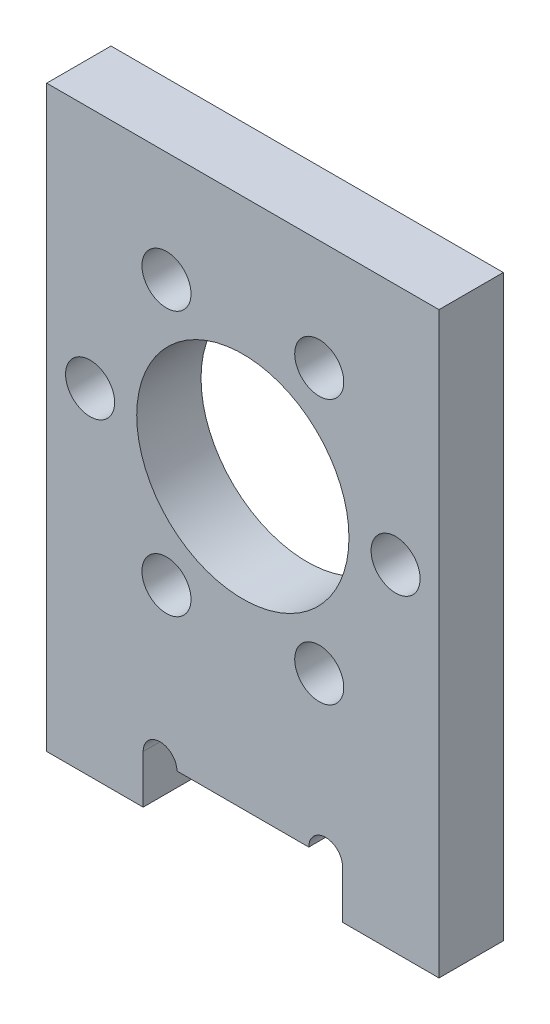
ISO-10303-21;
HEADER;
FILE_DESCRIPTION(('STEP AP214'),'2;1');
FILE_NAME('part.step','',(''),(''),'','','');
FILE_SCHEMA(('AUTOMOTIVE_DESIGN { 1 0 10303 214 1 1 1 1 }'));
ENDSEC;
DATA;
#1=APPLICATION_CONTEXT('core data for automotive mechanical design processes');
#2=APPLICATION_PROTOCOL_DEFINITION('international standard','automotive_design',2000,#1);
#3=PRODUCT_CONTEXT('',#1,'mechanical');
#4=PRODUCT('Part','Part','',(#3));
#5=PRODUCT_RELATED_PRODUCT_CATEGORY('part','',(#4));
#6=PRODUCT_DEFINITION_FORMATION('','',#4);
#7=PRODUCT_DEFINITION_CONTEXT('part definition',#1,'design');
#8=PRODUCT_DEFINITION('design','',#6,#7);
#9=PRODUCT_DEFINITION_SHAPE('','',#8);
#10=(LENGTH_UNIT() NAMED_UNIT(*) SI_UNIT(.MILLI.,.METRE.));
#11=(NAMED_UNIT(*) PLANE_ANGLE_UNIT() SI_UNIT($,.RADIAN.));
#12=(NAMED_UNIT(*) SI_UNIT($,.STERADIAN.) SOLID_ANGLE_UNIT());
#13=UNCERTAINTY_MEASURE_WITH_UNIT(LENGTH_MEASURE(1.E-05),#10,'distance_accuracy_value','');
#14=(GEOMETRIC_REPRESENTATION_CONTEXT(3) GLOBAL_UNCERTAINTY_ASSIGNED_CONTEXT((#13)) GLOBAL_UNIT_ASSIGNED_CONTEXT((#10,
#11,#12)) REPRESENTATION_CONTEXT('',''));
#15=CARTESIAN_POINT('',(0.,0.,0.));
#16=DIRECTION('',(0.,0.,1.));
#17=DIRECTION('',(1.,0.,0.));
#18=AXIS2_PLACEMENT_3D('',#15,#16,#17);
#19=CARTESIAN_POINT('',(-12.2,-16.5,4.));
#20=DIRECTION('',(0.,1.,0.));
#21=DIRECTION('',(0.,0.,1.));
#22=AXIS2_PLACEMENT_3D('',#19,#20,#21);
#23=PLANE('',#22);
#24=DIRECTION('',(1.,0.,0.));
#25=VECTOR('',#24,1.);
#26=CARTESIAN_POINT('',(-12.2,-16.5,0.));
#27=LINE('',#26,#25);
#28=CARTESIAN_POINT('',(-4.1,-16.5,0.));
#29=VERTEX_POINT('',#28);
#30=CARTESIAN_POINT('',(4.1,-16.5,0.));
#31=VERTEX_POINT('',#30);
#32=EDGE_CURVE('E97',#29,#31,#27,.T.);
#33=ORIENTED_EDGE('',*,*,#32,.T.);
#34=DIRECTION('',(0.,0.,-1.));
#35=VECTOR('',#34,1.);
#36=CARTESIAN_POINT('',(4.1,-16.5,6.9698484809835));
#37=LINE('',#36,#35);
#38=CARTESIAN_POINT('',(4.1,-16.5,4.));
#39=VERTEX_POINT('',#38);
#40=EDGE_CURVE('E140',#31,#39,#37,.F.);
#41=ORIENTED_EDGE('',*,*,#40,.T.);
#42=DIRECTION('',(1.,0.,0.));
#43=VECTOR('',#42,1.);
#44=CARTESIAN_POINT('',(-12.2,-16.5,4.));
#45=LINE('',#44,#43);
#46=CARTESIAN_POINT('',(-4.1,-16.5,4.));
#47=VERTEX_POINT('',#46);
#48=EDGE_CURVE('E89',#47,#39,#45,.T.);
#49=ORIENTED_EDGE('',*,*,#48,.F.);
#50=DIRECTION('',(0.,0.,-1.));
#51=VECTOR('',#50,1.);
#52=CARTESIAN_POINT('',(-4.1,-16.5,6.9698484809835));
#53=LINE('',#52,#51);
#54=EDGE_CURVE('E155',#47,#29,#53,.T.);
#55=ORIENTED_EDGE('',*,*,#54,.T.);
#56=EDGE_LOOP('',(#33,#41,#49,#55));
#57=FACE_BOUND('',#56,.T.);
#58=ADVANCED_FACE('F35',(#57),#23,.F.);
#59=CARTESIAN_POINT('',(12.2,-16.5,4.));
#60=DIRECTION('',(-1.,0.,0.));
#61=DIRECTION('',(0.,0.,1.));
#62=AXIS2_PLACEMENT_3D('',#59,#60,#61);
#63=PLANE('',#62);
#64=DIRECTION('',(0.,1.,0.));
#65=VECTOR('',#64,1.);
#66=CARTESIAN_POINT('',(12.2,-16.5,0.));
#67=LINE('',#66,#65);
#68=CARTESIAN_POINT('',(12.2,-19.5,0.));
#69=VERTEX_POINT('',#68);
#70=CARTESIAN_POINT('',(12.2,16.5,0.));
#71=VERTEX_POINT('',#70);
#72=EDGE_CURVE('E80',#69,#71,#67,.T.);
#73=ORIENTED_EDGE('',*,*,#72,.T.);
#74=DIRECTION('',(0.,0.,-1.));
#75=VECTOR('',#74,1.);
#76=CARTESIAN_POINT('',(12.2,16.5,4.));
#77=LINE('',#76,#75);
#78=CARTESIAN_POINT('',(12.2,16.5,4.));
#79=VERTEX_POINT('',#78);
#80=EDGE_CURVE('E11',#79,#71,#77,.T.);
#81=ORIENTED_EDGE('',*,*,#80,.F.);
#82=DIRECTION('',(0.,1.,0.));
#83=VECTOR('',#82,1.);
#84=CARTESIAN_POINT('',(12.2,-16.5,4.));
#85=LINE('',#84,#83);
#86=CARTESIAN_POINT('',(12.2,-19.5,4.));
#87=VERTEX_POINT('',#86);
#88=EDGE_CURVE('E100',#87,#79,#85,.T.);
#89=ORIENTED_EDGE('',*,*,#88,.F.);
#90=DIRECTION('',(0.,0.,1.));
#91=VECTOR('',#90,1.);
#92=CARTESIAN_POINT('',(12.2,-19.5,-6.70820393249937));
#93=LINE('',#92,#91);
#94=EDGE_CURVE('E113',#69,#87,#93,.T.);
#95=ORIENTED_EDGE('',*,*,#94,.F.);
#96=EDGE_LOOP('',(#73,#81,#89,#95));
#97=FACE_BOUND('',#96,.T.);
#98=ADVANCED_FACE('F37',(#97),#63,.F.);
#99=CARTESIAN_POINT('',(-12.2,16.5,4.));
#100=DIRECTION('',(0.,-1.,0.));
#101=DIRECTION('',(0.,0.,-1.));
#102=AXIS2_PLACEMENT_3D('',#99,#100,#101);
#103=PLANE('',#102);
#104=DIRECTION('',(-1.,0.,0.));
#105=VECTOR('',#104,1.);
#106=CARTESIAN_POINT('',(-12.2,16.5,0.));
#107=LINE('',#106,#105);
#108=CARTESIAN_POINT('',(-12.2,16.5,0.));
#109=VERTEX_POINT('',#108);
#110=EDGE_CURVE('E70',#71,#109,#107,.T.);
#111=ORIENTED_EDGE('',*,*,#110,.T.);
#112=DIRECTION('',(0.,0.,-1.));
#113=VECTOR('',#112,1.);
#114=CARTESIAN_POINT('',(-12.2,16.5,4.));
#115=LINE('',#114,#113);
#116=CARTESIAN_POINT('',(-12.2,16.5,4.));
#117=VERTEX_POINT('',#116);
#118=EDGE_CURVE('E43',#117,#109,#115,.T.);
#119=ORIENTED_EDGE('',*,*,#118,.F.);
#120=DIRECTION('',(-1.,0.,0.));
#121=VECTOR('',#120,1.);
#122=CARTESIAN_POINT('',(-12.2,16.5,4.));
#123=LINE('',#122,#121);
#124=EDGE_CURVE('E59',#79,#117,#123,.T.);
#125=ORIENTED_EDGE('',*,*,#124,.F.);
#126=ORIENTED_EDGE('',*,*,#80,.T.);
#127=EDGE_LOOP('',(#111,#119,#125,#126));
#128=FACE_BOUND('',#127,.T.);
#129=ADVANCED_FACE('F72',(#128),#103,.F.);
#130=CARTESIAN_POINT('',(-12.2,-16.5,4.));
#131=DIRECTION('',(1.,0.,0.));
#132=DIRECTION('',(0.,0.,-1.));
#133=AXIS2_PLACEMENT_3D('',#130,#131,#132);
#134=PLANE('',#133);
#135=DIRECTION('',(0.,-1.,0.));
#136=VECTOR('',#135,1.);
#137=CARTESIAN_POINT('',(-12.2,-16.5,0.));
#138=LINE('',#137,#136);
#139=CARTESIAN_POINT('',(-12.2,-19.5,0.));
#140=VERTEX_POINT('',#139);
#141=EDGE_CURVE('E79',#109,#140,#138,.T.);
#142=ORIENTED_EDGE('',*,*,#141,.T.);
#143=DIRECTION('',(0.,0.,1.));
#144=VECTOR('',#143,1.);
#145=CARTESIAN_POINT('',(-12.2,-19.5,-6.70820393249937));
#146=LINE('',#145,#144);
#147=CARTESIAN_POINT('',(-12.2,-19.5,4.));
#148=VERTEX_POINT('',#147);
#149=EDGE_CURVE('E137',#140,#148,#146,.T.);
#150=ORIENTED_EDGE('',*,*,#149,.T.);
#151=DIRECTION('',(0.,-1.,0.));
#152=VECTOR('',#151,1.);
#153=CARTESIAN_POINT('',(-12.2,-16.5,4.));
#154=LINE('',#153,#152);
#155=EDGE_CURVE('E88',#117,#148,#154,.T.);
#156=ORIENTED_EDGE('',*,*,#155,.F.);
#157=ORIENTED_EDGE('',*,*,#118,.T.);
#158=EDGE_LOOP('',(#142,#150,#156,#157));
#159=FACE_BOUND('',#158,.T.);
#160=ADVANCED_FACE('F84',(#159),#134,.F.);
#161=CARTESIAN_POINT('',(0.,0.,4.));
#162=DIRECTION('',(0.,0.,-1.));
#163=DIRECTION('',(-1.,0.,0.));
#164=AXIS2_PLACEMENT_3D('',#161,#162,#163);
#165=PLANE('',#164);
#166=CARTESIAN_POINT('',(-9.49999999999999,1.41007741946186,4.));
#167=DIRECTION('',(0.,0.,1.));
#168=DIRECTION('',(0.499999999999998,-0.86602540378444,0.));
#169=AXIS2_PLACEMENT_3D('',#166,#167,#168);
#170=CIRCLE('',#169,1.525);
#171=CARTESIAN_POINT('',(-8.73749999999999,0.0893886786905874,4.));
#172=VERTEX_POINT('',#171);
#173=EDGE_CURVE('E197',#172,#172,#170,.T.);
#174=ORIENTED_EDGE('',*,*,#173,.F.);
#175=EDGE_LOOP('',(#174));
#176=FACE_BOUND('',#175,.T.);
#177=CARTESIAN_POINT('',(-4.75000000000007,9.63731875541408,4.));
#178=DIRECTION('',(0.,0.,1.));
#179=DIRECTION('',(-0.500000000000004,-0.866025403784436,0.));
#180=AXIS2_PLACEMENT_3D('',#177,#178,#179);
#181=CIRCLE('',#180,1.525);
#182=CARTESIAN_POINT('',(-5.51250000000007,8.31663001464281,4.));
#183=VERTEX_POINT('',#182);
#184=EDGE_CURVE('E191',#183,#183,#181,.T.);
#185=ORIENTED_EDGE('',*,*,#184,.F.);
#186=EDGE_LOOP('',(#185));
#187=FACE_BOUND('',#186,.T.);
#188=CARTESIAN_POINT('',(4.74999999999989,9.63731875541418,4.));
#189=DIRECTION('',(0.,0.,1.));
#190=DIRECTION('',(-1.,0.,0.));
#191=AXIS2_PLACEMENT_3D('',#188,#189,#190);
#192=CIRCLE('',#191,1.525);
#193=CARTESIAN_POINT('',(3.22499999999989,9.63731875541418,4.));
#194=VERTEX_POINT('',#193);
#195=EDGE_CURVE('E185',#194,#194,#192,.T.);
#196=ORIENTED_EDGE('',*,*,#195,.F.);
#197=EDGE_LOOP('',(#196));
#198=FACE_BOUND('',#197,.T.);
#199=CARTESIAN_POINT('',(9.49999999999999,1.410077419462,4.));
#200=DIRECTION('',(0.,0.,1.));
#201=DIRECTION('',(-0.499999999999992,0.866025403784443,0.));
#202=AXIS2_PLACEMENT_3D('',#199,#200,#201);
#203=CIRCLE('',#202,1.525);
#204=CARTESIAN_POINT('',(8.7375,2.73076616023327,4.));
#205=VERTEX_POINT('',#204);
#206=EDGE_CURVE('E178',#205,#205,#203,.T.);
#207=ORIENTED_EDGE('',*,*,#206,.F.);
#208=EDGE_LOOP('',(#207));
#209=FACE_BOUND('',#208,.T.);
#210=CARTESIAN_POINT('',(4.75000000000001,-6.81716391649019,4.));
#211=DIRECTION('',(0.,0.,1.));
#212=DIRECTION('',(0.50000000000001,0.866025403784433,0.));
#213=AXIS2_PLACEMENT_3D('',#210,#211,#212);
#214=CIRCLE('',#213,1.525);
#215=CARTESIAN_POINT('',(5.51250000000002,-5.49647517571893,4.));
#216=VERTEX_POINT('',#215);
#217=EDGE_CURVE('E179',#216,#216,#214,.T.);
#218=ORIENTED_EDGE('',*,*,#217,.F.);
#219=EDGE_LOOP('',(#218));
#220=FACE_BOUND('',#219,.T.);
#221=CARTESIAN_POINT('',(-4.74999999999989,-6.81716391649026,4.));
#222=DIRECTION('',(0.,0.,1.));
#223=DIRECTION('',(1.,0.,0.));
#224=AXIS2_PLACEMENT_3D('',#221,#222,#223);
#225=CIRCLE('',#224,1.525);
#226=CARTESIAN_POINT('',(-3.22499999999989,-6.81716391649026,4.));
#227=VERTEX_POINT('',#226);
#228=EDGE_CURVE('E171',#227,#227,#225,.T.);
#229=ORIENTED_EDGE('',*,*,#228,.F.);
#230=EDGE_LOOP('',(#229));
#231=FACE_BOUND('',#230,.T.);
#232=CARTESIAN_POINT('',(0.,1.41007741946196,4.));
#233=DIRECTION('',(0.,0.,1.));
#234=DIRECTION('',(1.,0.,0.));
#235=AXIS2_PLACEMENT_3D('',#232,#233,#234);
#236=CIRCLE('',#235,6.59999999999999);
#237=CARTESIAN_POINT('',(6.59999999999999,1.41007741946196,4.));
#238=VERTEX_POINT('',#237);
#239=EDGE_CURVE('E110',#238,#238,#236,.T.);
#240=ORIENTED_EDGE('',*,*,#239,.F.);
#241=EDGE_LOOP('',(#240));
#242=FACE_BOUND('',#241,.T.);
#243=ORIENTED_EDGE('',*,*,#48,.T.);
#244=CARTESIAN_POINT('',(5.15,-16.5,4.));
#245=DIRECTION('',(0.,0.,-1.));
#246=DIRECTION('',(-1.,0.,0.));
#247=AXIS2_PLACEMENT_3D('',#244,#245,#246);
#248=CIRCLE('',#247,1.05);
#249=CARTESIAN_POINT('',(6.2,-16.5,4.));
#250=VERTEX_POINT('',#249);
#251=EDGE_CURVE('E158',#250,#39,#248,.F.);
#252=ORIENTED_EDGE('',*,*,#251,.F.);
#253=DIRECTION('',(0.,-1.,0.));
#254=VECTOR('',#253,1.);
#255=CARTESIAN_POINT('',(6.2,-16.5,4.));
#256=LINE('',#255,#254);
#257=CARTESIAN_POINT('',(6.2,-19.5,4.));
#258=VERTEX_POINT('',#257);
#259=EDGE_CURVE('E131',#250,#258,#256,.T.);
#260=ORIENTED_EDGE('',*,*,#259,.T.);
#261=DIRECTION('',(1.,0.,0.));
#262=VECTOR('',#261,1.);
#263=CARTESIAN_POINT('',(12.2,-19.5,4.));
#264=LINE('',#263,#262);
#265=EDGE_CURVE('E120',#258,#87,#264,.T.);
#266=ORIENTED_EDGE('',*,*,#265,.T.);
#267=ORIENTED_EDGE('',*,*,#88,.T.);
#268=ORIENTED_EDGE('',*,*,#124,.T.);
#269=ORIENTED_EDGE('',*,*,#155,.T.);
#270=DIRECTION('',(-1.,0.,0.));
#271=VECTOR('',#270,1.);
#272=CARTESIAN_POINT('',(-12.2,-19.5,4.));
#273=LINE('',#272,#271);
#274=CARTESIAN_POINT('',(-6.2,-19.5,4.));
#275=VERTEX_POINT('',#274);
#276=EDGE_CURVE('E144',#275,#148,#273,.T.);
#277=ORIENTED_EDGE('',*,*,#276,.F.);
#278=DIRECTION('',(0.,-1.,0.));
#279=VECTOR('',#278,1.);
#280=CARTESIAN_POINT('',(-6.2,-16.5,4.));
#281=LINE('',#280,#279);
#282=CARTESIAN_POINT('',(-6.2,-16.5,4.));
#283=VERTEX_POINT('',#282);
#284=EDGE_CURVE('E145',#283,#275,#281,.T.);
#285=ORIENTED_EDGE('',*,*,#284,.F.);
#286=CARTESIAN_POINT('',(-5.15,-16.5,4.));
#287=DIRECTION('',(0.,0.,-1.));
#288=DIRECTION('',(-1.,0.,0.));
#289=AXIS2_PLACEMENT_3D('',#286,#287,#288);
#290=CIRCLE('',#289,1.05);
#291=EDGE_CURVE('E50',#47,#283,#290,.F.);
#292=ORIENTED_EDGE('',*,*,#291,.F.);
#293=EDGE_LOOP('',(#243,#252,#260,#266,#267,#268,#269,#277,#285,#292));
#294=FACE_BOUND('',#293,.T.);
#295=ADVANCED_FACE('F208',(#176,#187,#198,#209,#220,#231,#242,#294),#165,.F.);
#296=CARTESIAN_POINT('',(0.,0.,0.));
#297=DIRECTION('',(0.,0.,-1.));
#298=DIRECTION('',(-1.,0.,0.));
#299=AXIS2_PLACEMENT_3D('',#296,#297,#298);
#300=PLANE('',#299);
#301=CARTESIAN_POINT('',(-9.49999999999999,1.41007741946186,0.));
#302=DIRECTION('',(0.,0.,-1.));
#303=DIRECTION('',(-1.,0.,0.));
#304=AXIS2_PLACEMENT_3D('',#301,#302,#303);
#305=CIRCLE('',#304,1.525);
#306=CARTESIAN_POINT('',(-11.025,1.41007741946186,0.));
#307=VERTEX_POINT('',#306);
#308=EDGE_CURVE('E174',#307,#307,#305,.F.);
#309=ORIENTED_EDGE('',*,*,#308,.T.);
#310=EDGE_LOOP('',(#309));
#311=FACE_BOUND('',#310,.T.);
#312=CARTESIAN_POINT('',(-4.75000000000007,9.63731875541408,0.));
#313=DIRECTION('',(0.,0.,-1.));
#314=DIRECTION('',(-1.,0.,0.));
#315=AXIS2_PLACEMENT_3D('',#312,#313,#314);
#316=CIRCLE('',#315,1.525);
#317=CARTESIAN_POINT('',(-6.27500000000007,9.63731875541408,0.));
#318=VERTEX_POINT('',#317);
#319=EDGE_CURVE('E194',#318,#318,#316,.F.);
#320=ORIENTED_EDGE('',*,*,#319,.T.);
#321=EDGE_LOOP('',(#320));
#322=FACE_BOUND('',#321,.T.);
#323=CARTESIAN_POINT('',(4.74999999999989,9.63731875541418,0.));
#324=DIRECTION('',(0.,0.,-1.));
#325=DIRECTION('',(-1.,0.,0.));
#326=AXIS2_PLACEMENT_3D('',#323,#324,#325);
#327=CIRCLE('',#326,1.525);
#328=CARTESIAN_POINT('',(3.22499999999989,9.63731875541418,0.));
#329=VERTEX_POINT('',#328);
#330=EDGE_CURVE('E188',#329,#329,#327,.F.);
#331=ORIENTED_EDGE('',*,*,#330,.T.);
#332=EDGE_LOOP('',(#331));
#333=FACE_BOUND('',#332,.T.);
#334=CARTESIAN_POINT('',(9.49999999999999,1.410077419462,0.));
#335=DIRECTION('',(0.,0.,-1.));
#336=DIRECTION('',(-1.,0.,0.));
#337=AXIS2_PLACEMENT_3D('',#334,#335,#336);
#338=CIRCLE('',#337,1.525);
#339=CARTESIAN_POINT('',(7.97499999999999,1.410077419462,0.));
#340=VERTEX_POINT('',#339);
#341=EDGE_CURVE('E182',#340,#340,#338,.F.);
#342=ORIENTED_EDGE('',*,*,#341,.T.);
#343=EDGE_LOOP('',(#342));
#344=FACE_BOUND('',#343,.T.);
#345=CARTESIAN_POINT('',(4.75000000000001,-6.81716391649019,0.));
#346=DIRECTION('',(0.,0.,-1.));
#347=DIRECTION('',(-1.,0.,0.));
#348=AXIS2_PLACEMENT_3D('',#345,#346,#347);
#349=CIRCLE('',#348,1.525);
#350=CARTESIAN_POINT('',(3.22500000000001,-6.81716391649019,0.));
#351=VERTEX_POINT('',#350);
#352=EDGE_CURVE('E175',#351,#351,#349,.F.);
#353=ORIENTED_EDGE('',*,*,#352,.T.);
#354=EDGE_LOOP('',(#353));
#355=FACE_BOUND('',#354,.T.);
#356=CARTESIAN_POINT('',(-4.74999999999989,-6.81716391649026,0.));
#357=DIRECTION('',(0.,0.,-1.));
#358=DIRECTION('',(-1.,0.,0.));
#359=AXIS2_PLACEMENT_3D('',#356,#357,#358);
#360=CIRCLE('',#359,1.525);
#361=CARTESIAN_POINT('',(-6.27499999999989,-6.81716391649026,0.));
#362=VERTEX_POINT('',#361);
#363=EDGE_CURVE('E164',#362,#362,#360,.F.);
#364=ORIENTED_EDGE('',*,*,#363,.T.);
#365=EDGE_LOOP('',(#364));
#366=FACE_BOUND('',#365,.T.);
#367=CARTESIAN_POINT('',(5.15,-16.5,0.));
#368=DIRECTION('',(0.,0.,-1.));
#369=DIRECTION('',(-1.,0.,0.));
#370=AXIS2_PLACEMENT_3D('',#367,#368,#369);
#371=CIRCLE('',#370,1.05);
#372=CARTESIAN_POINT('',(6.2,-16.5,0.));
#373=VERTEX_POINT('',#372);
#374=EDGE_CURVE('E160',#31,#373,#371,.T.);
#375=ORIENTED_EDGE('',*,*,#374,.F.);
#376=ORIENTED_EDGE('',*,*,#32,.F.);
#377=CARTESIAN_POINT('',(-5.15,-16.5,0.));
#378=DIRECTION('',(0.,0.,-1.));
#379=DIRECTION('',(-1.,0.,0.));
#380=AXIS2_PLACEMENT_3D('',#377,#378,#379);
#381=CIRCLE('',#380,1.05);
#382=CARTESIAN_POINT('',(-6.2,-16.5,0.));
#383=VERTEX_POINT('',#382);
#384=EDGE_CURVE('E161',#383,#29,#381,.T.);
#385=ORIENTED_EDGE('',*,*,#384,.F.);
#386=DIRECTION('',(0.,-1.,0.));
#387=VECTOR('',#386,1.);
#388=CARTESIAN_POINT('',(-6.2,-16.5,0.));
#389=LINE('',#388,#387);
#390=CARTESIAN_POINT('',(-6.2,-19.5,0.));
#391=VERTEX_POINT('',#390);
#392=EDGE_CURVE('E134',#383,#391,#389,.T.);
#393=ORIENTED_EDGE('',*,*,#392,.T.);
#394=DIRECTION('',(-1.,0.,0.));
#395=VECTOR('',#394,1.);
#396=CARTESIAN_POINT('',(-12.2,-19.5,0.));
#397=LINE('',#396,#395);
#398=EDGE_CURVE('E96',#391,#140,#397,.T.);
#399=ORIENTED_EDGE('',*,*,#398,.T.);
#400=ORIENTED_EDGE('',*,*,#141,.F.);
#401=ORIENTED_EDGE('',*,*,#110,.F.);
#402=ORIENTED_EDGE('',*,*,#72,.F.);
#403=DIRECTION('',(1.,0.,0.));
#404=VECTOR('',#403,1.);
#405=CARTESIAN_POINT('',(12.2,-19.5,0.));
#406=LINE('',#405,#404);
#407=CARTESIAN_POINT('',(6.2,-19.5,0.));
#408=VERTEX_POINT('',#407);
#409=EDGE_CURVE('E124',#408,#69,#406,.T.);
#410=ORIENTED_EDGE('',*,*,#409,.F.);
#411=DIRECTION('',(0.,-1.,0.));
#412=VECTOR('',#411,1.);
#413=CARTESIAN_POINT('',(6.2,-16.5,0.));
#414=LINE('',#413,#412);
#415=EDGE_CURVE('E119',#373,#408,#414,.T.);
#416=ORIENTED_EDGE('',*,*,#415,.F.);
#417=EDGE_LOOP('',(#375,#376,#385,#393,#399,#400,#401,#402,#410,#416));
#418=FACE_BOUND('',#417,.T.);
#419=CARTESIAN_POINT('',(0.,1.41007741946196,0.));
#420=DIRECTION('',(0.,0.,1.));
#421=DIRECTION('',(1.,0.,0.));
#422=AXIS2_PLACEMENT_3D('',#419,#420,#421);
#423=CIRCLE('',#422,6.59999999999999);
#424=CARTESIAN_POINT('',(6.59999999999999,1.41007741946196,0.));
#425=VERTEX_POINT('',#424);
#426=EDGE_CURVE('E104',#425,#425,#423,.T.);
#427=ORIENTED_EDGE('',*,*,#426,.T.);
#428=EDGE_LOOP('',(#427));
#429=FACE_BOUND('',#428,.T.);
#430=ADVANCED_FACE('F92',(#311,#322,#333,#344,#355,#366,#418,#429),#300,.T.);
#431=CARTESIAN_POINT('',(0.,1.41007741946196,0.));
#432=DIRECTION('',(0.,0.,1.));
#433=DIRECTION('',(1.,0.,0.));
#434=AXIS2_PLACEMENT_3D('',#431,#432,#433);
#435=CYLINDRICAL_SURFACE('',#434,6.59999999999999);
#436=ORIENTED_EDGE('',*,*,#426,.F.);
#437=EDGE_LOOP('',(#436));
#438=FACE_BOUND('',#437,.T.);
#439=ORIENTED_EDGE('',*,*,#239,.T.);
#440=EDGE_LOOP('',(#439));
#441=FACE_BOUND('',#440,.T.);
#442=ADVANCED_FACE('F318',(#438,#441),#435,.F.);
#443=CARTESIAN_POINT('',(6.2,-16.5,-6.70820393249937));
#444=DIRECTION('',(-1.,0.,0.));
#445=DIRECTION('',(0.,-1.,0.));
#446=AXIS2_PLACEMENT_3D('',#443,#444,#445);
#447=PLANE('',#446);
#448=DIRECTION('',(0.,0.,1.));
#449=VECTOR('',#448,1.);
#450=CARTESIAN_POINT('',(6.2,-16.5,-6.70820393249937));
#451=LINE('',#450,#449);
#452=EDGE_CURVE('E116',#373,#250,#451,.T.);
#453=ORIENTED_EDGE('',*,*,#452,.F.);
#454=ORIENTED_EDGE('',*,*,#415,.T.);
#455=DIRECTION('',(0.,0.,1.));
#456=VECTOR('',#455,1.);
#457=CARTESIAN_POINT('',(6.2,-19.5,-6.70820393249937));
#458=LINE('',#457,#456);
#459=EDGE_CURVE('E121',#408,#258,#458,.T.);
#460=ORIENTED_EDGE('',*,*,#459,.T.);
#461=ORIENTED_EDGE('',*,*,#259,.F.);
#462=EDGE_LOOP('',(#453,#454,#460,#461));
#463=FACE_BOUND('',#462,.T.);
#464=ADVANCED_FACE('F268',(#463),#447,.T.);
#465=CARTESIAN_POINT('',(12.2,-19.5,-6.70820393249937));
#466=DIRECTION('',(0.,-1.,0.));
#467=DIRECTION('',(0.,0.,-1.));
#468=AXIS2_PLACEMENT_3D('',#465,#466,#467);
#469=PLANE('',#468);
#470=ORIENTED_EDGE('',*,*,#459,.F.);
#471=ORIENTED_EDGE('',*,*,#409,.T.);
#472=ORIENTED_EDGE('',*,*,#94,.T.);
#473=ORIENTED_EDGE('',*,*,#265,.F.);
#474=EDGE_LOOP('',(#470,#471,#472,#473));
#475=FACE_BOUND('',#474,.T.);
#476=ADVANCED_FACE('F266',(#475),#469,.T.);
#477=CARTESIAN_POINT('',(-6.2,-16.5,-6.70820393249937));
#478=DIRECTION('',(-1.,0.,0.));
#479=DIRECTION('',(0.,-1.,0.));
#480=AXIS2_PLACEMENT_3D('',#477,#478,#479);
#481=PLANE('',#480);
#482=ORIENTED_EDGE('',*,*,#392,.F.);
#483=DIRECTION('',(0.,0.,1.));
#484=VECTOR('',#483,1.);
#485=CARTESIAN_POINT('',(-6.2,-16.5,-6.70820393249937));
#486=LINE('',#485,#484);
#487=EDGE_CURVE('E139',#383,#283,#486,.T.);
#488=ORIENTED_EDGE('',*,*,#487,.T.);
#489=ORIENTED_EDGE('',*,*,#284,.T.);
#490=DIRECTION('',(0.,0.,1.));
#491=VECTOR('',#490,1.);
#492=CARTESIAN_POINT('',(-6.2,-19.5,-6.70820393249937));
#493=LINE('',#492,#491);
#494=EDGE_CURVE('E141',#391,#275,#493,.T.);
#495=ORIENTED_EDGE('',*,*,#494,.F.);
#496=EDGE_LOOP('',(#482,#488,#489,#495));
#497=FACE_BOUND('',#496,.T.);
#498=ADVANCED_FACE('F274',(#497),#481,.F.);
#499=CARTESIAN_POINT('',(-12.2,-19.5,-6.70820393249937));
#500=DIRECTION('',(0.,1.,0.));
#501=DIRECTION('',(0.,0.,1.));
#502=AXIS2_PLACEMENT_3D('',#499,#500,#501);
#503=PLANE('',#502);
#504=ORIENTED_EDGE('',*,*,#398,.F.);
#505=ORIENTED_EDGE('',*,*,#494,.T.);
#506=ORIENTED_EDGE('',*,*,#276,.T.);
#507=ORIENTED_EDGE('',*,*,#149,.F.);
#508=EDGE_LOOP('',(#504,#505,#506,#507));
#509=FACE_BOUND('',#508,.T.);
#510=ADVANCED_FACE('F277',(#509),#503,.F.);
#511=CARTESIAN_POINT('',(-5.15,-16.5,6.9698484809835));
#512=DIRECTION('',(0.,0.,-1.));
#513=DIRECTION('',(-1.,0.,0.));
#514=AXIS2_PLACEMENT_3D('',#511,#512,#513);
#515=CYLINDRICAL_SURFACE('',#514,1.05);
#516=ORIENTED_EDGE('',*,*,#291,.T.);
#517=ORIENTED_EDGE('',*,*,#487,.F.);
#518=ORIENTED_EDGE('',*,*,#384,.T.);
#519=ORIENTED_EDGE('',*,*,#54,.F.);
#520=EDGE_LOOP('',(#516,#517,#518,#519));
#521=FACE_BOUND('',#520,.T.);
#522=ADVANCED_FACE('F279',(#521),#515,.F.);
#523=CARTESIAN_POINT('',(5.15,-16.5,6.9698484809835));
#524=DIRECTION('',(0.,0.,-1.));
#525=DIRECTION('',(-1.,0.,0.));
#526=AXIS2_PLACEMENT_3D('',#523,#524,#525);
#527=CYLINDRICAL_SURFACE('',#526,1.05);
#528=ORIENTED_EDGE('',*,*,#374,.T.);
#529=ORIENTED_EDGE('',*,*,#452,.T.);
#530=ORIENTED_EDGE('',*,*,#251,.T.);
#531=ORIENTED_EDGE('',*,*,#40,.F.);
#532=EDGE_LOOP('',(#528,#529,#530,#531));
#533=FACE_BOUND('',#532,.T.);
#534=ADVANCED_FACE('F270',(#533),#527,.F.);
#535=CARTESIAN_POINT('',(-4.74999999999989,-6.81716391649026,-4.31335136523794));
#536=DIRECTION('',(0.,0.,1.));
#537=DIRECTION('',(1.,0.,0.));
#538=AXIS2_PLACEMENT_3D('',#535,#536,#537);
#539=CYLINDRICAL_SURFACE('',#538,1.525);
#540=ORIENTED_EDGE('',*,*,#228,.T.);
#541=EDGE_LOOP('',(#540));
#542=FACE_BOUND('',#541,.T.);
#543=ORIENTED_EDGE('',*,*,#363,.F.);
#544=EDGE_LOOP('',(#543));
#545=FACE_BOUND('',#544,.T.);
#546=ADVANCED_FACE('F356',(#542,#545),#539,.F.);
#547=CARTESIAN_POINT('',(4.75000000000001,-6.81716391649019,-4.31335136523794));
#548=DIRECTION('',(0.,0.,1.));
#549=DIRECTION('',(1.,0.,0.));
#550=AXIS2_PLACEMENT_3D('',#547,#548,#549);
#551=CYLINDRICAL_SURFACE('',#550,1.525);
#552=ORIENTED_EDGE('',*,*,#217,.T.);
#553=EDGE_LOOP('',(#552));
#554=FACE_BOUND('',#553,.T.);
#555=ORIENTED_EDGE('',*,*,#352,.F.);
#556=EDGE_LOOP('',(#555));
#557=FACE_BOUND('',#556,.T.);
#558=ADVANCED_FACE('F364',(#554,#557),#551,.F.);
#559=CARTESIAN_POINT('',(9.49999999999999,1.410077419462,-4.31335136523794));
#560=DIRECTION('',(0.,0.,1.));
#561=DIRECTION('',(1.,0.,0.));
#562=AXIS2_PLACEMENT_3D('',#559,#560,#561);
#563=CYLINDRICAL_SURFACE('',#562,1.525);
#564=ORIENTED_EDGE('',*,*,#206,.T.);
#565=EDGE_LOOP('',(#564));
#566=FACE_BOUND('',#565,.T.);
#567=ORIENTED_EDGE('',*,*,#341,.F.);
#568=EDGE_LOOP('',(#567));
#569=FACE_BOUND('',#568,.T.);
#570=ADVANCED_FACE('F374',(#566,#569),#563,.F.);
#571=CARTESIAN_POINT('',(4.74999999999989,9.63731875541418,-4.31335136523794));
#572=DIRECTION('',(0.,0.,1.));
#573=DIRECTION('',(1.,0.,0.));
#574=AXIS2_PLACEMENT_3D('',#571,#572,#573);
#575=CYLINDRICAL_SURFACE('',#574,1.525);
#576=ORIENTED_EDGE('',*,*,#195,.T.);
#577=EDGE_LOOP('',(#576));
#578=FACE_BOUND('',#577,.T.);
#579=ORIENTED_EDGE('',*,*,#330,.F.);
#580=EDGE_LOOP('',(#579));
#581=FACE_BOUND('',#580,.T.);
#582=ADVANCED_FACE('F381',(#578,#581),#575,.F.);
#583=CARTESIAN_POINT('',(-4.75000000000007,9.63731875541408,-4.31335136523794));
#584=DIRECTION('',(0.,0.,1.));
#585=DIRECTION('',(1.,0.,0.));
#586=AXIS2_PLACEMENT_3D('',#583,#584,#585);
#587=CYLINDRICAL_SURFACE('',#586,1.525);
#588=ORIENTED_EDGE('',*,*,#184,.T.);
#589=EDGE_LOOP('',(#588));
#590=FACE_BOUND('',#589,.T.);
#591=ORIENTED_EDGE('',*,*,#319,.F.);
#592=EDGE_LOOP('',(#591));
#593=FACE_BOUND('',#592,.T.);
#594=ADVANCED_FACE('F389',(#590,#593),#587,.F.);
#595=CARTESIAN_POINT('',(-9.49999999999999,1.41007741946186,-4.31335136523794));
#596=DIRECTION('',(0.,0.,1.));
#597=DIRECTION('',(1.,0.,0.));
#598=AXIS2_PLACEMENT_3D('',#595,#596,#597);
#599=CYLINDRICAL_SURFACE('',#598,1.525);
#600=ORIENTED_EDGE('',*,*,#173,.T.);
#601=EDGE_LOOP('',(#600));
#602=FACE_BOUND('',#601,.T.);
#603=ORIENTED_EDGE('',*,*,#308,.F.);
#604=EDGE_LOOP('',(#603));
#605=FACE_BOUND('',#604,.T.);
#606=ADVANCED_FACE('F205',(#602,#605),#599,.F.);
#607=CLOSED_SHELL('',(#58,#98,#129,#160,#295,#430,#442,#464,#476,#498,#510,#522,#534,#546,#558,
#570,#582,#594,#606));
#608=MANIFOLD_SOLID_BREP('B2',#607);
#609=ADVANCED_BREP_SHAPE_REPRESENTATION('',(#18,#608),#14);
#610=SHAPE_DEFINITION_REPRESENTATION(#9,#609);
ENDSEC;
END-ISO-10303-21;
